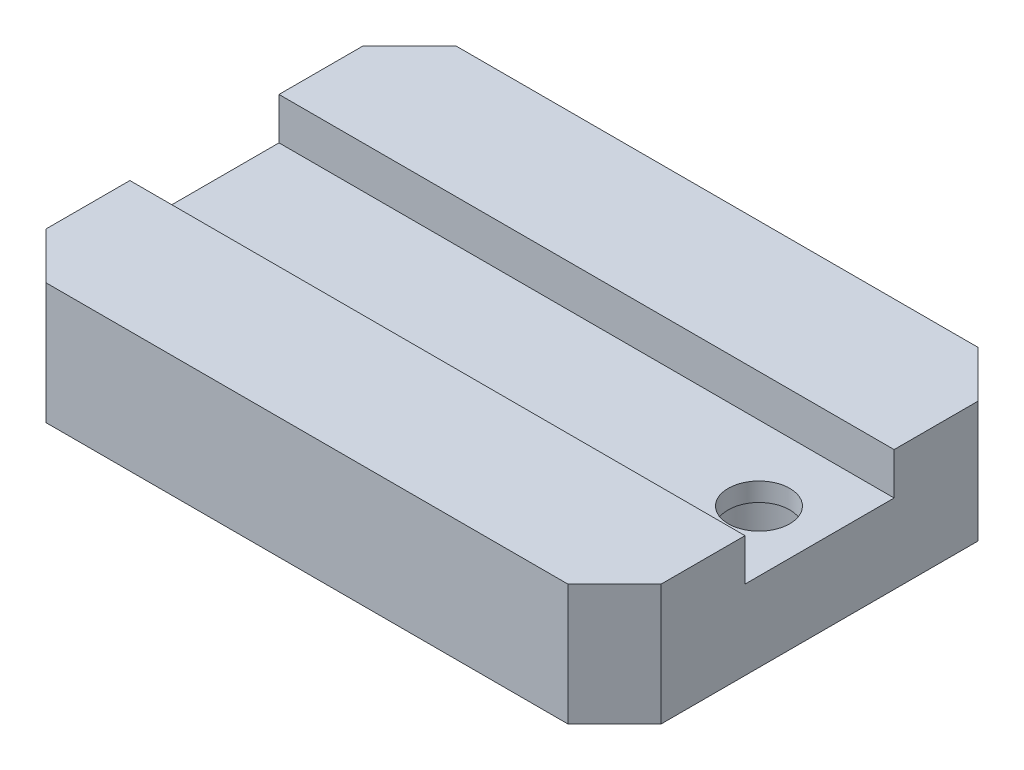
ISO-10303-21;
HEADER;
FILE_DESCRIPTION(('STEP AP214'),'2;1');
FILE_NAME('part.step','',(''),(''),'','','');
FILE_SCHEMA(('AUTOMOTIVE_DESIGN { 1 0 10303 214 1 1 1 1 }'));
ENDSEC;
DATA;
#1=APPLICATION_CONTEXT('core data for automotive mechanical design processes');
#2=APPLICATION_PROTOCOL_DEFINITION('international standard','automotive_design',2000,#1);
#3=PRODUCT_CONTEXT('',#1,'mechanical');
#4=PRODUCT('Part','Part','',(#3));
#5=PRODUCT_RELATED_PRODUCT_CATEGORY('part','',(#4));
#6=PRODUCT_DEFINITION_FORMATION('','',#4);
#7=PRODUCT_DEFINITION_CONTEXT('part definition',#1,'design');
#8=PRODUCT_DEFINITION('design','',#6,#7);
#9=PRODUCT_DEFINITION_SHAPE('','',#8);
#10=(LENGTH_UNIT() NAMED_UNIT(*) SI_UNIT(.MILLI.,.METRE.));
#11=(NAMED_UNIT(*) PLANE_ANGLE_UNIT() SI_UNIT($,.RADIAN.));
#12=(NAMED_UNIT(*) SI_UNIT($,.STERADIAN.) SOLID_ANGLE_UNIT());
#13=UNCERTAINTY_MEASURE_WITH_UNIT(LENGTH_MEASURE(1.E-05),#10,'distance_accuracy_value','');
#14=(GEOMETRIC_REPRESENTATION_CONTEXT(3) GLOBAL_UNCERTAINTY_ASSIGNED_CONTEXT((#13)) GLOBAL_UNIT_ASSIGNED_CONTEXT((#10,
#11,#12)) REPRESENTATION_CONTEXT('',''));
#15=CARTESIAN_POINT('',(0.,0.,0.));
#16=DIRECTION('',(0.,0.,1.));
#17=DIRECTION('',(1.,0.,0.));
#18=AXIS2_PLACEMENT_3D('',#15,#16,#17);
#19=CARTESIAN_POINT('',(0.,0.,44.));
#20=DIRECTION('',(0.,-1.,0.));
#21=DIRECTION('',(0.,0.,-1.));
#22=AXIS2_PLACEMENT_3D('',#19,#20,#21);
#23=PLANE('',#22);
#24=DIRECTION('',(-1.,0.,0.));
#25=VECTOR('',#24,1.);
#26=CARTESIAN_POINT('',(0.,0.,0.));
#27=LINE('',#26,#25);
#28=CARTESIAN_POINT('',(61.,0.,0.));
#29=VERTEX_POINT('',#28);
#30=CARTESIAN_POINT('',(5.00000000000002,0.,0.));
#31=VERTEX_POINT('',#30);
#32=EDGE_CURVE('E179',#29,#31,#27,.T.);
#33=ORIENTED_EDGE('',*,*,#32,.T.);
#34=DIRECTION('',(0.707106781186549,0.,-0.707106781186547));
#35=VECTOR('',#34,1.);
#36=CARTESIAN_POINT('',(0.,0.,5.));
#37=LINE('',#36,#35);
#38=CARTESIAN_POINT('',(0.,0.,5.));
#39=VERTEX_POINT('',#38);
#40=EDGE_CURVE('E233',#31,#39,#37,.F.);
#41=ORIENTED_EDGE('',*,*,#40,.T.);
#42=DIRECTION('',(0.,0.,-1.));
#43=VECTOR('',#42,1.);
#44=CARTESIAN_POINT('',(0.,0.,44.));
#45=LINE('',#44,#43);
#46=CARTESIAN_POINT('',(0.,0.,14.));
#47=VERTEX_POINT('',#46);
#48=EDGE_CURVE('E182',#47,#39,#45,.T.);
#49=ORIENTED_EDGE('',*,*,#48,.F.);
#50=DIRECTION('',(-1.,0.,0.));
#51=VECTOR('',#50,1.);
#52=CARTESIAN_POINT('',(0.,0.,14.));
#53=LINE('',#52,#51);
#54=CARTESIAN_POINT('',(66.,0.,14.));
#55=VERTEX_POINT('',#54);
#56=EDGE_CURVE('E160',#55,#47,#53,.T.);
#57=ORIENTED_EDGE('',*,*,#56,.F.);
#58=DIRECTION('',(0.,0.,-1.));
#59=VECTOR('',#58,1.);
#60=CARTESIAN_POINT('',(66.,0.,44.));
#61=LINE('',#60,#59);
#62=CARTESIAN_POINT('',(66.,0.,5.));
#63=VERTEX_POINT('',#62);
#64=EDGE_CURVE('E193',#55,#63,#61,.T.);
#65=ORIENTED_EDGE('',*,*,#64,.T.);
#66=DIRECTION('',(0.707106781186549,0.,0.707106781186547));
#67=VECTOR('',#66,1.);
#68=CARTESIAN_POINT('',(66.,0.,5.));
#69=LINE('',#68,#67);
#70=EDGE_CURVE('E230',#63,#29,#69,.F.);
#71=ORIENTED_EDGE('',*,*,#70,.T.);
#72=EDGE_LOOP('',(#33,#41,#49,#57,#65,#71));
#73=FACE_BOUND('',#72,.T.);
#74=ADVANCED_FACE('F46',(#73),#23,.F.);
#75=CARTESIAN_POINT('',(0.,0.,44.));
#76=DIRECTION('',(1.,0.,0.));
#77=DIRECTION('',(0.,0.,-1.));
#78=AXIS2_PLACEMENT_3D('',#75,#76,#77);
#79=PLANE('',#78);
#80=ORIENTED_EDGE('',*,*,#48,.T.);
#81=DIRECTION('',(0.,-1.,0.));
#82=VECTOR('',#81,1.);
#83=CARTESIAN_POINT('',(0.,0.,5.));
#84=LINE('',#83,#82);
#85=CARTESIAN_POINT('',(0.,-13.,5.));
#86=VERTEX_POINT('',#85);
#87=EDGE_CURVE('E208',#39,#86,#84,.T.);
#88=ORIENTED_EDGE('',*,*,#87,.T.);
#89=DIRECTION('',(0.,0.,-1.));
#90=VECTOR('',#89,1.);
#91=CARTESIAN_POINT('',(0.,-13.,44.));
#92=LINE('',#91,#90);
#93=CARTESIAN_POINT('',(0.,-13.,39.));
#94=VERTEX_POINT('',#93);
#95=EDGE_CURVE('E201',#94,#86,#92,.T.);
#96=ORIENTED_EDGE('',*,*,#95,.F.);
#97=DIRECTION('',(0.,1.,0.));
#98=VECTOR('',#97,1.);
#99=CARTESIAN_POINT('',(0.,0.,39.));
#100=LINE('',#99,#98);
#101=CARTESIAN_POINT('',(0.,0.,39.));
#102=VERTEX_POINT('',#101);
#103=EDGE_CURVE('E205',#94,#102,#100,.T.);
#104=ORIENTED_EDGE('',*,*,#103,.T.);
#105=CARTESIAN_POINT('',(0.,0.,30.));
#106=VERTEX_POINT('',#105);
#107=EDGE_CURVE('E164',#102,#106,#45,.T.);
#108=ORIENTED_EDGE('',*,*,#107,.T.);
#109=DIRECTION('',(0.,1.,0.));
#110=VECTOR('',#109,1.);
#111=CARTESIAN_POINT('',(0.,-4.5,30.));
#112=LINE('',#111,#110);
#113=CARTESIAN_POINT('',(0.,-4.5,30.));
#114=VERTEX_POINT('',#113);
#115=EDGE_CURVE('E142',#114,#106,#112,.T.);
#116=ORIENTED_EDGE('',*,*,#115,.F.);
#117=DIRECTION('',(0.,0.,1.));
#118=VECTOR('',#117,1.);
#119=CARTESIAN_POINT('',(0.,-4.5,14.));
#120=LINE('',#119,#118);
#121=CARTESIAN_POINT('',(0.,-4.5,14.));
#122=VERTEX_POINT('',#121);
#123=EDGE_CURVE('E150',#122,#114,#120,.T.);
#124=ORIENTED_EDGE('',*,*,#123,.F.);
#125=DIRECTION('',(0.,1.,0.));
#126=VECTOR('',#125,1.);
#127=CARTESIAN_POINT('',(0.,-4.5,14.));
#128=LINE('',#127,#126);
#129=EDGE_CURVE('E187',#122,#47,#128,.T.);
#130=ORIENTED_EDGE('',*,*,#129,.T.);
#131=EDGE_LOOP('',(#80,#88,#96,#104,#108,#116,#124,#130));
#132=FACE_BOUND('',#131,.T.);
#133=ADVANCED_FACE('F163',(#132),#79,.F.);
#134=CARTESIAN_POINT('',(0.,-13.,44.));
#135=DIRECTION('',(0.,1.,0.));
#136=DIRECTION('',(0.,0.,1.));
#137=AXIS2_PLACEMENT_3D('',#134,#135,#136);
#138=PLANE('',#137);
#139=CARTESIAN_POINT('',(59.5,-13.,22.));
#140=DIRECTION('',(0.,-1.,0.));
#141=DIRECTION('',(0.,0.,-1.));
#142=AXIS2_PLACEMENT_3D('',#139,#140,#141);
#143=CIRCLE('',#142,5.5);
#144=CARTESIAN_POINT('',(59.5,-13.,16.5));
#145=VERTEX_POINT('',#144);
#146=EDGE_CURVE('E276',#145,#145,#143,.T.);
#147=ORIENTED_EDGE('',*,*,#146,.F.);
#148=EDGE_LOOP('',(#147));
#149=FACE_BOUND('',#148,.T.);
#150=ORIENTED_EDGE('',*,*,#95,.T.);
#151=DIRECTION('',(-0.707106781186549,0.,0.707106781186547));
#152=VECTOR('',#151,1.);
#153=CARTESIAN_POINT('',(0.,-13.,5.));
#154=LINE('',#153,#152);
#155=CARTESIAN_POINT('',(5.00000000000002,-13.,0.));
#156=VERTEX_POINT('',#155);
#157=EDGE_CURVE('E221',#86,#156,#154,.F.);
#158=ORIENTED_EDGE('',*,*,#157,.T.);
#159=DIRECTION('',(1.,0.,0.));
#160=VECTOR('',#159,1.);
#161=CARTESIAN_POINT('',(0.,-13.,0.));
#162=LINE('',#161,#160);
#163=CARTESIAN_POINT('',(61.,-13.,0.));
#164=VERTEX_POINT('',#163);
#165=EDGE_CURVE('E183',#156,#164,#162,.T.);
#166=ORIENTED_EDGE('',*,*,#165,.T.);
#167=DIRECTION('',(-0.707106781186549,0.,-0.707106781186547));
#168=VECTOR('',#167,1.);
#169=CARTESIAN_POINT('',(66.,-13.,5.));
#170=LINE('',#169,#168);
#171=CARTESIAN_POINT('',(66.,-13.,5.));
#172=VERTEX_POINT('',#171);
#173=EDGE_CURVE('E218',#164,#172,#170,.F.);
#174=ORIENTED_EDGE('',*,*,#173,.T.);
#175=DIRECTION('',(0.,0.,-1.));
#176=VECTOR('',#175,1.);
#177=CARTESIAN_POINT('',(66.,-13.,44.));
#178=LINE('',#177,#176);
#179=CARTESIAN_POINT('',(66.,-13.,39.));
#180=VERTEX_POINT('',#179);
#181=EDGE_CURVE('E197',#180,#172,#178,.T.);
#182=ORIENTED_EDGE('',*,*,#181,.F.);
#183=DIRECTION('',(-0.707106781186547,0.,0.707106781186549));
#184=VECTOR('',#183,1.);
#185=CARTESIAN_POINT('',(61.,-13.,44.));
#186=LINE('',#185,#184);
#187=CARTESIAN_POINT('',(61.,-13.,44.));
#188=VERTEX_POINT('',#187);
#189=EDGE_CURVE('E215',#180,#188,#186,.T.);
#190=ORIENTED_EDGE('',*,*,#189,.T.);
#191=DIRECTION('',(1.,0.,0.));
#192=VECTOR('',#191,1.);
#193=CARTESIAN_POINT('',(0.,-13.,44.));
#194=LINE('',#193,#192);
#195=CARTESIAN_POINT('',(5.,-13.,44.));
#196=VERTEX_POINT('',#195);
#197=EDGE_CURVE('E174',#196,#188,#194,.T.);
#198=ORIENTED_EDGE('',*,*,#197,.F.);
#199=DIRECTION('',(-0.707106781186547,0.,-0.707106781186549));
#200=VECTOR('',#199,1.);
#201=CARTESIAN_POINT('',(5.,-13.,44.));
#202=LINE('',#201,#200);
#203=EDGE_CURVE('E212',#196,#94,#202,.T.);
#204=ORIENTED_EDGE('',*,*,#203,.T.);
#205=EDGE_LOOP('',(#150,#158,#166,#174,#182,#190,#198,#204));
#206=FACE_BOUND('',#205,.T.);
#207=ADVANCED_FACE('F293',(#149,#206),#138,.F.);
#208=CARTESIAN_POINT('',(66.,0.,44.));
#209=DIRECTION('',(-1.,0.,0.));
#210=DIRECTION('',(0.,0.,1.));
#211=AXIS2_PLACEMENT_3D('',#208,#209,#210);
#212=PLANE('',#211);
#213=ORIENTED_EDGE('',*,*,#181,.T.);
#214=DIRECTION('',(0.,1.,0.));
#215=VECTOR('',#214,1.);
#216=CARTESIAN_POINT('',(66.,0.,5.));
#217=LINE('',#216,#215);
#218=EDGE_CURVE('E239',#172,#63,#217,.T.);
#219=ORIENTED_EDGE('',*,*,#218,.T.);
#220=ORIENTED_EDGE('',*,*,#64,.F.);
#221=DIRECTION('',(0.,1.,0.));
#222=VECTOR('',#221,1.);
#223=CARTESIAN_POINT('',(66.,-4.5,14.));
#224=LINE('',#223,#222);
#225=CARTESIAN_POINT('',(66.,-4.5,14.));
#226=VERTEX_POINT('',#225);
#227=EDGE_CURVE('E169',#226,#55,#224,.T.);
#228=ORIENTED_EDGE('',*,*,#227,.F.);
#229=DIRECTION('',(0.,0.,-1.));
#230=VECTOR('',#229,1.);
#231=CARTESIAN_POINT('',(66.,-4.5,14.));
#232=LINE('',#231,#230);
#233=CARTESIAN_POINT('',(66.,-4.5,30.));
#234=VERTEX_POINT('',#233);
#235=EDGE_CURVE('E149',#234,#226,#232,.T.);
#236=ORIENTED_EDGE('',*,*,#235,.F.);
#237=DIRECTION('',(0.,1.,0.));
#238=VECTOR('',#237,1.);
#239=CARTESIAN_POINT('',(66.,-4.5,30.));
#240=LINE('',#239,#238);
#241=CARTESIAN_POINT('',(66.,0.,30.));
#242=VERTEX_POINT('',#241);
#243=EDGE_CURVE('E145',#234,#242,#240,.T.);
#244=ORIENTED_EDGE('',*,*,#243,.T.);
#245=CARTESIAN_POINT('',(66.,0.,39.));
#246=VERTEX_POINT('',#245);
#247=EDGE_CURVE('E194',#246,#242,#61,.T.);
#248=ORIENTED_EDGE('',*,*,#247,.F.);
#249=DIRECTION('',(0.,-1.,0.));
#250=VECTOR('',#249,1.);
#251=CARTESIAN_POINT('',(66.,-13.,39.));
#252=LINE('',#251,#250);
#253=EDGE_CURVE('E236',#246,#180,#252,.T.);
#254=ORIENTED_EDGE('',*,*,#253,.T.);
#255=EDGE_LOOP('',(#213,#219,#220,#228,#236,#244,#248,#254));
#256=FACE_BOUND('',#255,.T.);
#257=ADVANCED_FACE('F296',(#256),#212,.F.);
#258=DIRECTION('',(-1.,0.,0.));
#259=VECTOR('',#258,1.);
#260=CARTESIAN_POINT('',(0.,0.,44.));
#261=LINE('',#260,#259);
#262=CARTESIAN_POINT('',(61.,0.,44.));
#263=VERTEX_POINT('',#262);
#264=CARTESIAN_POINT('',(5.,0.,44.));
#265=VERTEX_POINT('',#264);
#266=EDGE_CURVE('E178',#263,#265,#261,.T.);
#267=ORIENTED_EDGE('',*,*,#266,.F.);
#268=DIRECTION('',(0.707106781186547,0.,-0.707106781186549));
#269=VECTOR('',#268,1.);
#270=CARTESIAN_POINT('',(61.,0.,44.));
#271=LINE('',#270,#269);
#272=EDGE_CURVE('E11',#263,#246,#271,.T.);
#273=ORIENTED_EDGE('',*,*,#272,.T.);
#274=ORIENTED_EDGE('',*,*,#247,.T.);
#275=DIRECTION('',(1.,0.,0.));
#276=VECTOR('',#275,1.);
#277=CARTESIAN_POINT('',(0.,0.,30.));
#278=LINE('',#277,#276);
#279=EDGE_CURVE('E262',#106,#242,#278,.T.);
#280=ORIENTED_EDGE('',*,*,#279,.F.);
#281=ORIENTED_EDGE('',*,*,#107,.F.);
#282=DIRECTION('',(0.707106781186547,0.,0.707106781186549));
#283=VECTOR('',#282,1.);
#284=CARTESIAN_POINT('',(5.,0.,44.));
#285=LINE('',#284,#283);
#286=EDGE_CURVE('E56',#102,#265,#285,.T.);
#287=ORIENTED_EDGE('',*,*,#286,.T.);
#288=EDGE_LOOP('',(#267,#273,#274,#280,#281,#287));
#289=FACE_BOUND('',#288,.T.);
#290=ADVANCED_FACE('F310',(#289),#23,.F.);
#291=CARTESIAN_POINT('',(0.,0.,44.));
#292=DIRECTION('',(0.,0.,1.));
#293=DIRECTION('',(1.,0.,0.));
#294=AXIS2_PLACEMENT_3D('',#291,#292,#293);
#295=PLANE('',#294);
#296=ORIENTED_EDGE('',*,*,#197,.T.);
#297=DIRECTION('',(0.,1.,0.));
#298=VECTOR('',#297,1.);
#299=CARTESIAN_POINT('',(61.,0.,44.));
#300=LINE('',#299,#298);
#301=EDGE_CURVE('E247',#188,#263,#300,.T.);
#302=ORIENTED_EDGE('',*,*,#301,.T.);
#303=ORIENTED_EDGE('',*,*,#266,.T.);
#304=DIRECTION('',(0.,-1.,0.));
#305=VECTOR('',#304,1.);
#306=CARTESIAN_POINT('',(5.,-13.,44.));
#307=LINE('',#306,#305);
#308=EDGE_CURVE('E243',#265,#196,#307,.T.);
#309=ORIENTED_EDGE('',*,*,#308,.T.);
#310=EDGE_LOOP('',(#296,#302,#303,#309));
#311=FACE_BOUND('',#310,.T.);
#312=ADVANCED_FACE('F306',(#311),#295,.T.);
#313=CARTESIAN_POINT('',(0.,0.,0.));
#314=DIRECTION('',(0.,0.,1.));
#315=DIRECTION('',(1.,0.,0.));
#316=AXIS2_PLACEMENT_3D('',#313,#314,#315);
#317=PLANE('',#316);
#318=ORIENTED_EDGE('',*,*,#165,.F.);
#319=DIRECTION('',(0.,1.,0.));
#320=VECTOR('',#319,1.);
#321=CARTESIAN_POINT('',(5.00000000000002,0.,0.));
#322=LINE('',#321,#320);
#323=EDGE_CURVE('E227',#156,#31,#322,.T.);
#324=ORIENTED_EDGE('',*,*,#323,.T.);
#325=ORIENTED_EDGE('',*,*,#32,.F.);
#326=DIRECTION('',(0.,-1.,0.));
#327=VECTOR('',#326,1.);
#328=CARTESIAN_POINT('',(61.,0.,0.));
#329=LINE('',#328,#327);
#330=EDGE_CURVE('E224',#29,#164,#329,.T.);
#331=ORIENTED_EDGE('',*,*,#330,.T.);
#332=EDGE_LOOP('',(#318,#324,#325,#331));
#333=FACE_BOUND('',#332,.T.);
#334=ADVANCED_FACE('F323',(#333),#317,.F.);
#335=CARTESIAN_POINT('',(0.,-4.5,14.));
#336=DIRECTION('',(0.,0.,-1.));
#337=DIRECTION('',(-1.,0.,0.));
#338=AXIS2_PLACEMENT_3D('',#335,#336,#337);
#339=PLANE('',#338);
#340=ORIENTED_EDGE('',*,*,#56,.T.);
#341=ORIENTED_EDGE('',*,*,#129,.F.);
#342=DIRECTION('',(-1.,0.,0.));
#343=VECTOR('',#342,1.);
#344=CARTESIAN_POINT('',(0.,-4.5,14.));
#345=LINE('',#344,#343);
#346=EDGE_CURVE('E156',#226,#122,#345,.T.);
#347=ORIENTED_EDGE('',*,*,#346,.F.);
#348=ORIENTED_EDGE('',*,*,#227,.T.);
#349=EDGE_LOOP('',(#340,#341,#347,#348));
#350=FACE_BOUND('',#349,.T.);
#351=ADVANCED_FACE('F314',(#350),#339,.F.);
#352=CARTESIAN_POINT('',(0.,-4.5,30.));
#353=DIRECTION('',(0.,0.,1.));
#354=DIRECTION('',(1.,0.,0.));
#355=AXIS2_PLACEMENT_3D('',#352,#353,#354);
#356=PLANE('',#355);
#357=ORIENTED_EDGE('',*,*,#279,.T.);
#358=ORIENTED_EDGE('',*,*,#243,.F.);
#359=DIRECTION('',(1.,0.,0.));
#360=VECTOR('',#359,1.);
#361=CARTESIAN_POINT('',(0.,-4.5,30.));
#362=LINE('',#361,#360);
#363=EDGE_CURVE('E137',#114,#234,#362,.T.);
#364=ORIENTED_EDGE('',*,*,#363,.F.);
#365=ORIENTED_EDGE('',*,*,#115,.T.);
#366=EDGE_LOOP('',(#357,#358,#364,#365));
#367=FACE_BOUND('',#366,.T.);
#368=ADVANCED_FACE('F140',(#367),#356,.F.);
#369=CARTESIAN_POINT('',(0.,-4.5,0.));
#370=DIRECTION('',(0.,1.,0.));
#371=DIRECTION('',(0.,0.,1.));
#372=AXIS2_PLACEMENT_3D('',#369,#370,#371);
#373=PLANE('',#372);
#374=CARTESIAN_POINT('',(59.5,-4.5,22.));
#375=DIRECTION('',(0.,1.,0.));
#376=DIRECTION('',(0.,0.,1.));
#377=AXIS2_PLACEMENT_3D('',#374,#375,#376);
#378=CIRCLE('',#377,3.3);
#379=CARTESIAN_POINT('',(59.5,-4.5,25.3));
#380=VERTEX_POINT('',#379);
#381=EDGE_CURVE('E264',#380,#380,#378,.T.);
#382=ORIENTED_EDGE('',*,*,#381,.F.);
#383=EDGE_LOOP('',(#382));
#384=FACE_BOUND('',#383,.T.);
#385=ORIENTED_EDGE('',*,*,#123,.T.);
#386=ORIENTED_EDGE('',*,*,#363,.T.);
#387=ORIENTED_EDGE('',*,*,#235,.T.);
#388=ORIENTED_EDGE('',*,*,#346,.T.);
#389=EDGE_LOOP('',(#385,#386,#387,#388));
#390=FACE_BOUND('',#389,.T.);
#391=ADVANCED_FACE('F154',(#384,#390),#373,.T.);
#392=CARTESIAN_POINT('',(0.,0.,5.));
#393=DIRECTION('',(0.707106781186547,0.,0.707106781186549));
#394=DIRECTION('',(0.,-1.,0.));
#395=AXIS2_PLACEMENT_3D('',#392,#393,#394);
#396=PLANE('',#395);
#397=ORIENTED_EDGE('',*,*,#40,.F.);
#398=ORIENTED_EDGE('',*,*,#323,.F.);
#399=ORIENTED_EDGE('',*,*,#157,.F.);
#400=ORIENTED_EDGE('',*,*,#87,.F.);
#401=EDGE_LOOP('',(#397,#398,#399,#400));
#402=FACE_BOUND('',#401,.T.);
#403=ADVANCED_FACE('F321',(#402),#396,.F.);
#404=CARTESIAN_POINT('',(66.,0.,5.));
#405=DIRECTION('',(-0.707106781186547,0.,0.707106781186549));
#406=DIRECTION('',(0.,1.,0.));
#407=AXIS2_PLACEMENT_3D('',#404,#405,#406);
#408=PLANE('',#407);
#409=ORIENTED_EDGE('',*,*,#173,.F.);
#410=ORIENTED_EDGE('',*,*,#330,.F.);
#411=ORIENTED_EDGE('',*,*,#70,.F.);
#412=ORIENTED_EDGE('',*,*,#218,.F.);
#413=EDGE_LOOP('',(#409,#410,#411,#412));
#414=FACE_BOUND('',#413,.T.);
#415=ADVANCED_FACE('F328',(#414),#408,.F.);
#416=CARTESIAN_POINT('',(61.,0.,44.));
#417=DIRECTION('',(0.707106781186548,0.,0.707106781186546));
#418=DIRECTION('',(0.,-1.,0.));
#419=AXIS2_PLACEMENT_3D('',#416,#417,#418);
#420=PLANE('',#419);
#421=ORIENTED_EDGE('',*,*,#189,.F.);
#422=ORIENTED_EDGE('',*,*,#253,.F.);
#423=ORIENTED_EDGE('',*,*,#272,.F.);
#424=ORIENTED_EDGE('',*,*,#301,.F.);
#425=EDGE_LOOP('',(#421,#422,#423,#424));
#426=FACE_BOUND('',#425,.T.);
#427=ADVANCED_FACE('F309',(#426),#420,.T.);
#428=CARTESIAN_POINT('',(5.,0.,44.));
#429=DIRECTION('',(-0.707106781186549,0.,0.707106781186547));
#430=DIRECTION('',(0.,1.,0.));
#431=AXIS2_PLACEMENT_3D('',#428,#429,#430);
#432=PLANE('',#431);
#433=ORIENTED_EDGE('',*,*,#286,.F.);
#434=ORIENTED_EDGE('',*,*,#103,.F.);
#435=ORIENTED_EDGE('',*,*,#203,.F.);
#436=ORIENTED_EDGE('',*,*,#308,.F.);
#437=EDGE_LOOP('',(#433,#434,#435,#436));
#438=FACE_BOUND('',#437,.T.);
#439=ADVANCED_FACE('F49',(#438),#432,.T.);
#440=CARTESIAN_POINT('',(59.5,-6.5,22.));
#441=DIRECTION('',(0.,1.,0.));
#442=DIRECTION('',(0.,0.,1.));
#443=AXIS2_PLACEMENT_3D('',#440,#441,#442);
#444=CYLINDRICAL_SURFACE('',#443,3.3);
#445=CARTESIAN_POINT('',(59.5,-6.5,22.));
#446=DIRECTION('',(0.,1.,0.));
#447=DIRECTION('',(0.,0.,1.));
#448=AXIS2_PLACEMENT_3D('',#445,#446,#447);
#449=CIRCLE('',#448,3.3);
#450=CARTESIAN_POINT('',(59.5,-6.5,25.3));
#451=VERTEX_POINT('',#450);
#452=EDGE_CURVE('E271',#451,#451,#449,.T.);
#453=ORIENTED_EDGE('',*,*,#452,.F.);
#454=EDGE_LOOP('',(#453));
#455=FACE_BOUND('',#454,.T.);
#456=ORIENTED_EDGE('',*,*,#381,.T.);
#457=EDGE_LOOP('',(#456));
#458=FACE_BOUND('',#457,.T.);
#459=ADVANCED_FACE('F444',(#455,#458),#444,.F.);
#460=CARTESIAN_POINT('',(59.5,-6.5,22.));
#461=DIRECTION('',(0.,-1.,0.));
#462=DIRECTION('',(0.,0.,-1.));
#463=AXIS2_PLACEMENT_3D('',#460,#461,#462);
#464=PLANE('',#463);
#465=CARTESIAN_POINT('',(59.5,-6.5,22.));
#466=DIRECTION('',(0.,-1.,0.));
#467=DIRECTION('',(0.,0.,-1.));
#468=AXIS2_PLACEMENT_3D('',#465,#466,#467);
#469=CIRCLE('',#468,5.5);
#470=CARTESIAN_POINT('',(59.5,-6.5,16.5));
#471=VERTEX_POINT('',#470);
#472=EDGE_CURVE('E275',#471,#471,#469,.T.);
#473=ORIENTED_EDGE('',*,*,#472,.T.);
#474=EDGE_LOOP('',(#473));
#475=FACE_BOUND('',#474,.T.);
#476=ORIENTED_EDGE('',*,*,#452,.T.);
#477=EDGE_LOOP('',(#476));
#478=FACE_BOUND('',#477,.T.);
#479=ADVANCED_FACE('F284',(#475,#478),#464,.T.);
#480=CARTESIAN_POINT('',(59.5,-6.5,22.));
#481=DIRECTION('',(0.,-1.,0.));
#482=DIRECTION('',(0.,0.,-1.));
#483=AXIS2_PLACEMENT_3D('',#480,#481,#482);
#484=CYLINDRICAL_SURFACE('',#483,5.5);
#485=CARTESIAN_POINT('',(59.5,-6.5,16.5));
#486=CARTESIAN_POINT('',(59.5,-6.56770833333333,16.5));
#487=CARTESIAN_POINT('',(59.5,-6.63541666666667,16.5));
#488=CARTESIAN_POINT('',(59.5,-6.77083333333333,16.5));
#489=CARTESIAN_POINT('',(59.5,-6.83854166666667,16.5));
#490=CARTESIAN_POINT('',(59.5,-6.97395833333333,16.5));
#491=CARTESIAN_POINT('',(59.5,-7.04166666666667,16.5));
#492=CARTESIAN_POINT('',(59.5,-7.17708333333333,16.5));
#493=CARTESIAN_POINT('',(59.5,-7.24479166666667,16.5));
#494=CARTESIAN_POINT('',(59.5,-7.38020833333333,16.5));
#495=CARTESIAN_POINT('',(59.5,-7.44791666666667,16.5));
#496=CARTESIAN_POINT('',(59.5,-7.58333333333333,16.5));
#497=CARTESIAN_POINT('',(59.5,-7.65104166666667,16.5));
#498=CARTESIAN_POINT('',(59.5,-7.78645833333333,16.5));
#499=CARTESIAN_POINT('',(59.5,-7.85416666666667,16.5));
#500=CARTESIAN_POINT('',(59.5,-7.98958333333333,16.5));
#501=CARTESIAN_POINT('',(59.5,-8.05729166666667,16.5));
#502=CARTESIAN_POINT('',(59.5,-8.19270833333333,16.5));
#503=CARTESIAN_POINT('',(59.5,-8.26041666666667,16.5));
#504=CARTESIAN_POINT('',(59.5,-8.39583333333333,16.5));
#505=CARTESIAN_POINT('',(59.5,-8.46354166666667,16.5));
#506=CARTESIAN_POINT('',(59.5,-8.59895833333333,16.5));
#507=CARTESIAN_POINT('',(59.5,-8.66666666666667,16.5));
#508=CARTESIAN_POINT('',(59.5,-8.80208333333333,16.5));
#509=CARTESIAN_POINT('',(59.5,-8.86979166666667,16.5));
#510=CARTESIAN_POINT('',(59.5,-9.00520833333333,16.5));
#511=CARTESIAN_POINT('',(59.5,-9.07291666666667,16.5));
#512=CARTESIAN_POINT('',(59.5,-9.20833333333333,16.5));
#513=CARTESIAN_POINT('',(59.5,-9.27604166666667,16.5));
#514=CARTESIAN_POINT('',(59.5,-9.41145833333333,16.5));
#515=CARTESIAN_POINT('',(59.5,-9.47916666666667,16.5));
#516=CARTESIAN_POINT('',(59.5,-9.61458333333333,16.5));
#517=CARTESIAN_POINT('',(59.5,-9.68229166666667,16.5));
#518=CARTESIAN_POINT('',(59.5,-9.81770833333333,16.5));
#519=CARTESIAN_POINT('',(59.5,-9.88541666666667,16.5));
#520=CARTESIAN_POINT('',(59.5,-10.0208333333333,16.5));
#521=CARTESIAN_POINT('',(59.5,-10.0885416666667,16.5));
#522=CARTESIAN_POINT('',(59.5,-10.2239583333333,16.5));
#523=CARTESIAN_POINT('',(59.5,-10.2916666666667,16.5));
#524=CARTESIAN_POINT('',(59.5,-10.4270833333333,16.5));
#525=CARTESIAN_POINT('',(59.5,-10.4947916666667,16.5));
#526=CARTESIAN_POINT('',(59.5,-10.6302083333333,16.5));
#527=CARTESIAN_POINT('',(59.5,-10.6979166666667,16.5));
#528=CARTESIAN_POINT('',(59.5,-10.8333333333333,16.5));
#529=CARTESIAN_POINT('',(59.5,-10.9010416666667,16.5));
#530=CARTESIAN_POINT('',(59.5,-11.0364583333333,16.5));
#531=CARTESIAN_POINT('',(59.5,-11.1041666666667,16.5));
#532=CARTESIAN_POINT('',(59.5,-11.2395833333333,16.5));
#533=CARTESIAN_POINT('',(59.5,-11.3072916666667,16.5));
#534=CARTESIAN_POINT('',(59.5,-11.4427083333333,16.5));
#535=CARTESIAN_POINT('',(59.5,-11.5104166666667,16.5));
#536=CARTESIAN_POINT('',(59.5,-11.6458333333333,16.5));
#537=CARTESIAN_POINT('',(59.5,-11.7135416666667,16.5));
#538=CARTESIAN_POINT('',(59.5,-11.8489583333333,16.5));
#539=CARTESIAN_POINT('',(59.5,-11.9166666666667,16.5));
#540=CARTESIAN_POINT('',(59.5,-12.0520833333333,16.5));
#541=CARTESIAN_POINT('',(59.5,-12.1197916666667,16.5));
#542=CARTESIAN_POINT('',(59.5,-12.2552083333333,16.5));
#543=CARTESIAN_POINT('',(59.5,-12.3229166666667,16.5));
#544=CARTESIAN_POINT('',(59.5,-12.4583333333333,16.5));
#545=CARTESIAN_POINT('',(59.5,-12.5260416666667,16.5));
#546=CARTESIAN_POINT('',(59.5,-12.6614583333333,16.5));
#547=CARTESIAN_POINT('',(59.5,-12.7291666666667,16.5));
#548=CARTESIAN_POINT('',(59.5,-12.8645833333333,16.5));
#549=CARTESIAN_POINT('',(59.5,-12.9322916666667,16.5));
#550=CARTESIAN_POINT('',(59.5,-13.,16.5));
#551=B_SPLINE_CURVE_WITH_KNOTS('',3,(#485,#486,#487,#488,#489,#490,#491,#492,#493,#494,#495,
#496,#497,#498,#499,#500,#501,#502,#503,#504,#505,#506,#507,#508,#509,#510,#511,#512,#513,#514,
#515,#516,#517,#518,#519,#520,#521,#522,#523,#524,#525,#526,#527,#528,#529,#530,#531,#532,#533,
#534,#535,#536,#537,#538,#539,#540,#541,#542,#543,#544,#545,#546,#547,#548,#549,#550),
.UNSPECIFIED.,.F.,.F.,(4,2,2,2,2,2,2,2,2,2,2,2,2,2,2,2,2,2,2,2,2,2,2,2,2,2,2,2,2,2,2,2,4),(0.,
0.203125,0.40625,0.609375000000001,0.812500000000001,1.015625,1.21875,1.421875,1.625,1.828125,
2.03125,2.234375,2.4375,2.640625,2.84375,3.046875,3.25,3.453125,3.65625,3.859375,4.0625,
4.265625,4.46875,4.671875,4.875,5.078125,5.28125,5.484375,5.6875,5.890625,6.09375,6.296875,6.5),.UNSPECIFIED.);
#552=EDGE_CURVE('BSEAM287',#471,#145,#551,.T.);
#553=ORIENTED_EDGE('',*,*,#472,.F.);
#554=ORIENTED_EDGE('',*,*,#146,.T.);
#555=ORIENTED_EDGE('',*,*,#552,.T.);
#556=ORIENTED_EDGE('',*,*,#552,.F.);
#557=EDGE_LOOP('',(#553,#555,#554,#556));
#558=FACE_BOUND('',#557,.T.);
#559=ADVANCED_FACE('F287',(#558),#484,.F.);
#560=CLOSED_SHELL('',(#74,#133,#207,#257,#290,#312,#334,#351,#368,#391,#403,#415,#427,#439,#459,
#479,#559));
#561=MANIFOLD_SOLID_BREP('B2',#560);
#562=ADVANCED_BREP_SHAPE_REPRESENTATION('',(#18,#561),#14);
#563=SHAPE_DEFINITION_REPRESENTATION(#9,#562);
ENDSEC;
END-ISO-10303-21;
